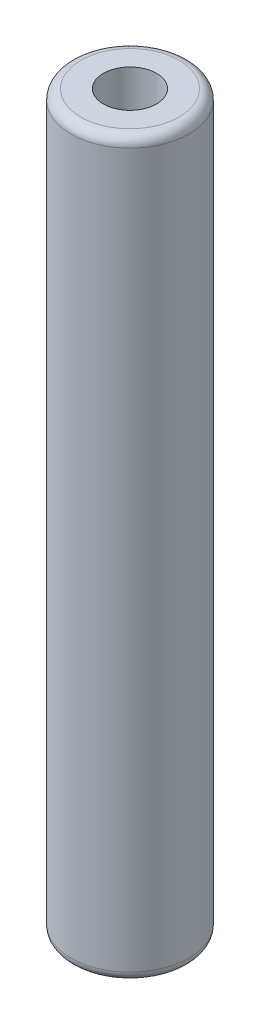
ISO-10303-21;
HEADER;
FILE_DESCRIPTION(('STEP AP214'),'2;1');
FILE_NAME('part.step','',(''),(''),'','','');
FILE_SCHEMA(('AUTOMOTIVE_DESIGN { 1 0 10303 214 1 1 1 1 }'));
ENDSEC;
DATA;
#1=APPLICATION_CONTEXT('core data for automotive mechanical design processes');
#2=APPLICATION_PROTOCOL_DEFINITION('international standard','automotive_design',2000,#1);
#3=PRODUCT_CONTEXT('',#1,'mechanical');
#4=PRODUCT('Part','Part','',(#3));
#5=PRODUCT_RELATED_PRODUCT_CATEGORY('part','',(#4));
#6=PRODUCT_DEFINITION_FORMATION('','',#4);
#7=PRODUCT_DEFINITION_CONTEXT('part definition',#1,'design');
#8=PRODUCT_DEFINITION('design','',#6,#7);
#9=PRODUCT_DEFINITION_SHAPE('','',#8);
#10=(LENGTH_UNIT() NAMED_UNIT(*) SI_UNIT(.MILLI.,.METRE.));
#11=(NAMED_UNIT(*) PLANE_ANGLE_UNIT() SI_UNIT($,.RADIAN.));
#12=(NAMED_UNIT(*) SI_UNIT($,.STERADIAN.) SOLID_ANGLE_UNIT());
#13=UNCERTAINTY_MEASURE_WITH_UNIT(LENGTH_MEASURE(1.E-05),#10,'distance_accuracy_value','');
#14=(GEOMETRIC_REPRESENTATION_CONTEXT(3) GLOBAL_UNCERTAINTY_ASSIGNED_CONTEXT((#13)) GLOBAL_UNIT_ASSIGNED_CONTEXT((#10,
#11,#12)) REPRESENTATION_CONTEXT('',''));
#15=CARTESIAN_POINT('',(0.,0.,0.));
#16=DIRECTION('',(0.,0.,1.));
#17=DIRECTION('',(1.,0.,0.));
#18=AXIS2_PLACEMENT_3D('',#15,#16,#17);
#19=CARTESIAN_POINT('',(0.,-18.65,0.));
#20=DIRECTION('',(0.,1.,0.));
#21=DIRECTION('',(0.,0.,1.));
#22=AXIS2_PLACEMENT_3D('',#19,#20,#21);
#23=CYLINDRICAL_SURFACE('',#22,3.);
#24=CARTESIAN_POINT('',(0.,-18.15,0.));
#25=DIRECTION('',(0.,1.,0.));
#26=DIRECTION('',(0.,0.,1.));
#27=AXIS2_PLACEMENT_3D('',#24,#25,#26);
#28=CIRCLE('',#27,3.);
#29=CARTESIAN_POINT('',(0.,-18.15,3.));
#30=VERTEX_POINT('',#29);
#31=EDGE_CURVE('E73',#30,#30,#28,.T.);
#32=ORIENTED_EDGE('',*,*,#31,.T.);
#33=EDGE_LOOP('',(#32));
#34=FACE_BOUND('',#33,.T.);
#35=CARTESIAN_POINT('',(0.,18.15,0.));
#36=DIRECTION('',(0.,1.,0.));
#37=DIRECTION('',(0.,0.,1.));
#38=AXIS2_PLACEMENT_3D('',#35,#36,#37);
#39=CIRCLE('',#38,3.);
#40=CARTESIAN_POINT('',(0.,18.15,3.));
#41=VERTEX_POINT('',#40);
#42=EDGE_CURVE('E70',#41,#41,#39,.F.);
#43=ORIENTED_EDGE('',*,*,#42,.T.);
#44=EDGE_LOOP('',(#43));
#45=FACE_BOUND('',#44,.T.);
#46=ADVANCED_FACE('F35',(#34,#45),#23,.T.);
#47=CARTESIAN_POINT('',(0.,-18.65,0.));
#48=DIRECTION('',(0.,1.,0.));
#49=DIRECTION('',(0.,0.,1.));
#50=AXIS2_PLACEMENT_3D('',#47,#48,#49);
#51=PLANE('',#50);
#52=CARTESIAN_POINT('',(0.,-18.65,0.));
#53=DIRECTION('',(0.,1.,0.));
#54=DIRECTION('',(0.,0.,1.));
#55=AXIS2_PLACEMENT_3D('',#52,#53,#54);
#56=CIRCLE('',#55,2.5);
#57=CARTESIAN_POINT('',(0.,-18.65,2.5));
#58=VERTEX_POINT('',#57);
#59=EDGE_CURVE('E43',#58,#58,#56,.F.);
#60=ORIENTED_EDGE('',*,*,#59,.T.);
#61=EDGE_LOOP('',(#60));
#62=FACE_BOUND('',#61,.T.);
#63=CARTESIAN_POINT('',(0.,-18.65,0.));
#64=DIRECTION('',(0.,-1.,0.));
#65=DIRECTION('',(0.,0.,-1.));
#66=AXIS2_PLACEMENT_3D('',#63,#64,#65);
#67=CIRCLE('',#66,1.35254999999999);
#68=CARTESIAN_POINT('',(0.,-18.65,-1.35254999999999));
#69=VERTEX_POINT('',#68);
#70=EDGE_CURVE('E60',#69,#69,#67,.T.);
#71=ORIENTED_EDGE('',*,*,#70,.F.);
#72=EDGE_LOOP('',(#71));
#73=FACE_BOUND('',#72,.T.);
#74=ADVANCED_FACE('F78',(#62,#73),#51,.F.);
#75=CARTESIAN_POINT('',(0.,18.65,0.));
#76=DIRECTION('',(0.,1.,0.));
#77=DIRECTION('',(0.,0.,1.));
#78=AXIS2_PLACEMENT_3D('',#75,#76,#77);
#79=PLANE('',#78);
#80=CARTESIAN_POINT('',(0.,18.65,0.));
#81=DIRECTION('',(0.,1.,0.));
#82=DIRECTION('',(0.,0.,1.));
#83=AXIS2_PLACEMENT_3D('',#80,#81,#82);
#84=CIRCLE('',#83,2.5);
#85=CARTESIAN_POINT('',(0.,18.65,2.5));
#86=VERTEX_POINT('',#85);
#87=EDGE_CURVE('E11',#86,#86,#84,.T.);
#88=ORIENTED_EDGE('',*,*,#87,.T.);
#89=EDGE_LOOP('',(#88));
#90=FACE_BOUND('',#89,.T.);
#91=CARTESIAN_POINT('',(0.,18.65,0.));
#92=DIRECTION('',(0.,1.,0.));
#93=DIRECTION('',(0.,0.,1.));
#94=AXIS2_PLACEMENT_3D('',#91,#92,#93);
#95=CIRCLE('',#94,1.35254999999999);
#96=CARTESIAN_POINT('',(0.,18.65,1.35254999999999));
#97=VERTEX_POINT('',#96);
#98=EDGE_CURVE('E59',#97,#97,#95,.T.);
#99=ORIENTED_EDGE('',*,*,#98,.F.);
#100=EDGE_LOOP('',(#99));
#101=FACE_BOUND('',#100,.T.);
#102=ADVANCED_FACE('F95',(#90,#101),#79,.T.);
#103=CARTESIAN_POINT('',(0.,6.15,0.));
#104=DIRECTION('',(0.,1.,0.));
#105=DIRECTION('',(0.,0.,1.));
#106=AXIS2_PLACEMENT_3D('',#103,#104,#105);
#107=CONICAL_SURFACE('',#106,1.35255,1.02974425867665);
#108=CARTESIAN_POINT('',(0.,5.33730596973427,0.));
#109=VERTEX_POINT('',#108);
#110=VERTEX_LOOP('',#109);
#111=FACE_BOUND('',#110,.T.);
#112=CARTESIAN_POINT('',(0.,6.15,0.));
#113=DIRECTION('',(0.,1.,0.));
#114=DIRECTION('',(0.,0.,1.));
#115=AXIS2_PLACEMENT_3D('',#112,#113,#114);
#116=CIRCLE('',#115,1.35255);
#117=CARTESIAN_POINT('',(0.,6.15,1.35255));
#118=VERTEX_POINT('',#117);
#119=EDGE_CURVE('E63',#118,#118,#116,.T.);
#120=ORIENTED_EDGE('',*,*,#119,.T.);
#121=EDGE_LOOP('',(#120));
#122=FACE_BOUND('',#121,.T.);
#123=ADVANCED_FACE('F98',(#111,#122),#107,.F.);
#124=CARTESIAN_POINT('',(0.,18.65,0.));
#125=DIRECTION('',(0.,1.,0.));
#126=DIRECTION('',(0.,0.,1.));
#127=AXIS2_PLACEMENT_3D('',#124,#125,#126);
#128=CYLINDRICAL_SURFACE('',#127,1.35254999999999);
#129=ORIENTED_EDGE('',*,*,#119,.F.);
#130=EDGE_LOOP('',(#129));
#131=FACE_BOUND('',#130,.T.);
#132=ORIENTED_EDGE('',*,*,#98,.T.);
#133=EDGE_LOOP('',(#132));
#134=FACE_BOUND('',#133,.T.);
#135=ADVANCED_FACE('F53',(#131,#134),#128,.F.);
#136=CARTESIAN_POINT('',(0.,-6.15,0.));
#137=DIRECTION('',(0.,-1.,0.));
#138=DIRECTION('',(0.,0.,-1.));
#139=AXIS2_PLACEMENT_3D('',#136,#137,#138);
#140=CONICAL_SURFACE('',#139,1.35255,1.02974425867665);
#141=CARTESIAN_POINT('',(0.,-5.33730596973427,0.));
#142=VERTEX_POINT('',#141);
#143=VERTEX_LOOP('',#142);
#144=FACE_BOUND('',#143,.T.);
#145=CARTESIAN_POINT('',(0.,-6.15,0.));
#146=DIRECTION('',(0.,-1.,0.));
#147=DIRECTION('',(0.,0.,-1.));
#148=AXIS2_PLACEMENT_3D('',#145,#146,#147);
#149=CIRCLE('',#148,1.35255);
#150=CARTESIAN_POINT('',(0.,-6.15,-1.35255));
#151=VERTEX_POINT('',#150);
#152=EDGE_CURVE('E57',#151,#151,#149,.T.);
#153=ORIENTED_EDGE('',*,*,#152,.T.);
#154=EDGE_LOOP('',(#153));
#155=FACE_BOUND('',#154,.T.);
#156=ADVANCED_FACE('F49',(#144,#155),#140,.F.);
#157=CARTESIAN_POINT('',(0.,-18.65,0.));
#158=DIRECTION('',(0.,-1.,0.));
#159=DIRECTION('',(0.,0.,-1.));
#160=AXIS2_PLACEMENT_3D('',#157,#158,#159);
#161=CYLINDRICAL_SURFACE('',#160,1.35254999999999);
#162=ORIENTED_EDGE('',*,*,#152,.F.);
#163=EDGE_LOOP('',(#162));
#164=FACE_BOUND('',#163,.T.);
#165=ORIENTED_EDGE('',*,*,#70,.T.);
#166=EDGE_LOOP('',(#165));
#167=FACE_BOUND('',#166,.T.);
#168=ADVANCED_FACE('F52',(#164,#167),#161,.F.);
#169=CARTESIAN_POINT('',(0.,-18.15,0.));
#170=DIRECTION('',(0.,1.,0.));
#171=DIRECTION('',(0.,0.,1.));
#172=AXIS2_PLACEMENT_3D('',#169,#170,#171);
#173=TOROIDAL_SURFACE('',#172,2.5,0.5);
#174=ORIENTED_EDGE('',*,*,#59,.F.);
#175=EDGE_LOOP('',(#174));
#176=FACE_BOUND('',#175,.T.);
#177=ORIENTED_EDGE('',*,*,#31,.F.);
#178=EDGE_LOOP('',(#177));
#179=FACE_BOUND('',#178,.T.);
#180=ADVANCED_FACE('F81',(#176,#179),#173,.T.);
#181=CARTESIAN_POINT('',(0.,18.15,0.));
#182=DIRECTION('',(0.,1.,0.));
#183=DIRECTION('',(0.,0.,1.));
#184=AXIS2_PLACEMENT_3D('',#181,#182,#183);
#185=TOROIDAL_SURFACE('',#184,2.5,0.5);
#186=ORIENTED_EDGE('',*,*,#42,.F.);
#187=EDGE_LOOP('',(#186));
#188=FACE_BOUND('',#187,.T.);
#189=ORIENTED_EDGE('',*,*,#87,.F.);
#190=EDGE_LOOP('',(#189));
#191=FACE_BOUND('',#190,.T.);
#192=ADVANCED_FACE('F37',(#188,#191),#185,.T.);
#193=CLOSED_SHELL('',(#46,#74,#102,#123,#135,#156,#168,#180,#192));
#194=MANIFOLD_SOLID_BREP('B2',#193);
#195=ADVANCED_BREP_SHAPE_REPRESENTATION('',(#18,#194),#14);
#196=SHAPE_DEFINITION_REPRESENTATION(#9,#195);
ENDSEC;
END-ISO-10303-21;
